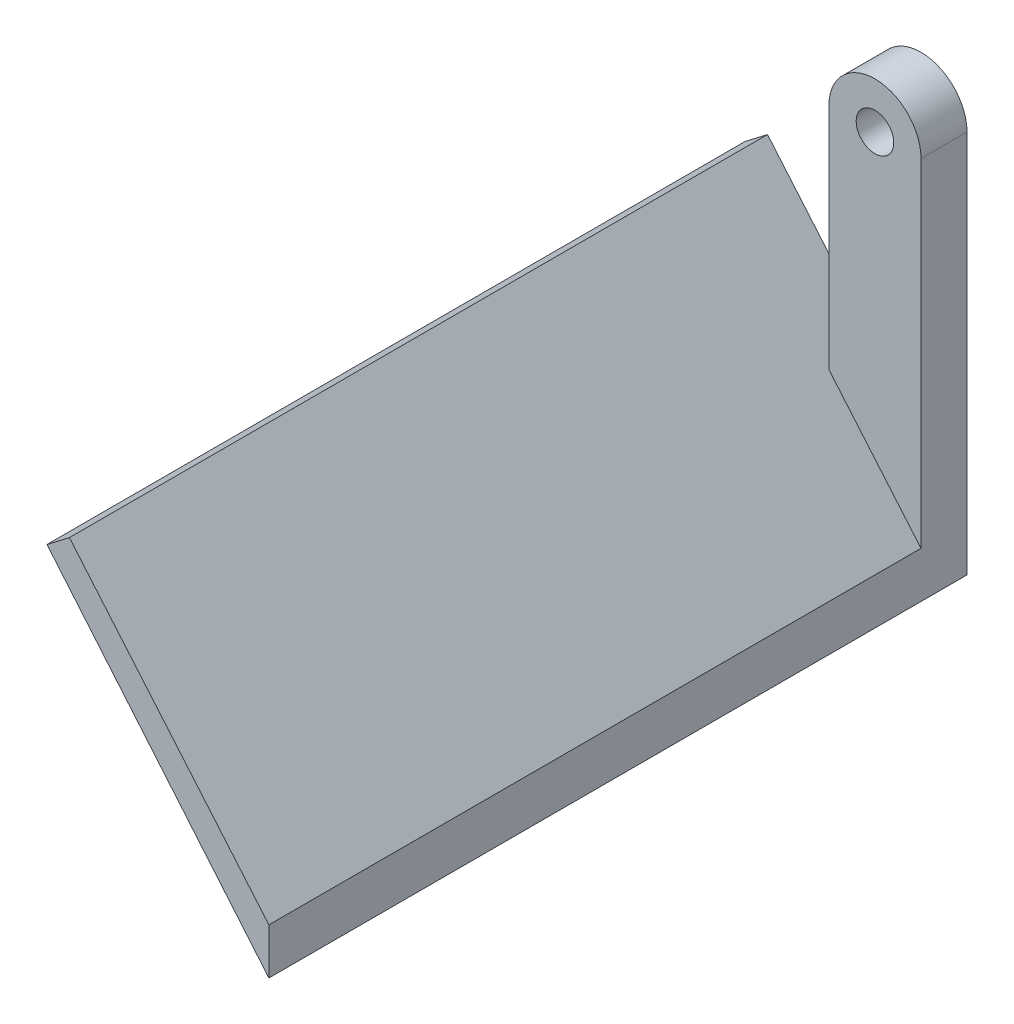
ISO-10303-21;
HEADER;
FILE_DESCRIPTION(('STEP AP214'),'2;1');
FILE_NAME('part.step','',(''),(''),'','','');
FILE_SCHEMA(('AUTOMOTIVE_DESIGN { 1 0 10303 214 1 1 1 1 }'));
ENDSEC;
DATA;
#1=APPLICATION_CONTEXT('core data for automotive mechanical design processes');
#2=APPLICATION_PROTOCOL_DEFINITION('international standard','automotive_design',2000,#1);
#3=PRODUCT_CONTEXT('',#1,'mechanical');
#4=PRODUCT('Part','Part','',(#3));
#5=PRODUCT_RELATED_PRODUCT_CATEGORY('part','',(#4));
#6=PRODUCT_DEFINITION_FORMATION('','',#4);
#7=PRODUCT_DEFINITION_CONTEXT('part definition',#1,'design');
#8=PRODUCT_DEFINITION('design','',#6,#7);
#9=PRODUCT_DEFINITION_SHAPE('','',#8);
#10=(LENGTH_UNIT() NAMED_UNIT(*) SI_UNIT(.MILLI.,.METRE.));
#11=(NAMED_UNIT(*) PLANE_ANGLE_UNIT() SI_UNIT($,.RADIAN.));
#12=(NAMED_UNIT(*) SI_UNIT($,.STERADIAN.) SOLID_ANGLE_UNIT());
#13=UNCERTAINTY_MEASURE_WITH_UNIT(LENGTH_MEASURE(1.E-05),#10,'distance_accuracy_value','');
#14=(GEOMETRIC_REPRESENTATION_CONTEXT(3) GLOBAL_UNCERTAINTY_ASSIGNED_CONTEXT((#13)) GLOBAL_UNIT_ASSIGNED_CONTEXT((#10,
#11,#12)) REPRESENTATION_CONTEXT('',''));
#15=CARTESIAN_POINT('',(0.,0.,0.));
#16=DIRECTION('',(0.,0.,1.));
#17=DIRECTION('',(1.,0.,0.));
#18=AXIS2_PLACEMENT_3D('',#15,#16,#17);
#19=CARTESIAN_POINT('',(5.10000000001886,-2.35037225318191E-11,-2903.88301881174));
#20=DIRECTION('',(0.,0.,-1.));
#21=DIRECTION('',(-1.,0.,0.));
#22=AXIS2_PLACEMENT_3D('',#19,#20,#21);
#23=PLANE('',#22);
#24=CARTESIAN_POINT('',(5.10000000001886,-2.35037225318191E-11,-2903.88301881174));
#25=DIRECTION('',(0.,0.,-1.));
#26=DIRECTION('',(-1.,0.,0.));
#27=AXIS2_PLACEMENT_3D('',#24,#25,#26);
#28=CIRCLE('',#27,2.45);
#29=CARTESIAN_POINT('',(2.65000000001886,-2.35037225318191E-11,-2903.88301881174));
#30=VERTEX_POINT('',#29);
#31=EDGE_CURVE('E166',#30,#30,#28,.T.);
#32=ORIENTED_EDGE('',*,*,#31,.T.);
#33=EDGE_LOOP('',(#32));
#34=FACE_BOUND('',#33,.T.);
#35=DIRECTION('',(-0.646174074926617,0.763190058172098,0.));
#36=VECTOR('',#35,1.);
#37=CARTESIAN_POINT('',(-13.1040053232568,-15.4128793657481,-2903.88301881174));
#38=LINE('',#37,#36);
#39=CARTESIAN_POINT('',(11.1000000000189,-44.0000000000235,-2903.88301881174));
#40=VERTEX_POINT('',#39);
#41=CARTESIAN_POINT('',(-0.899999999981139,-29.8269140570363,-2903.88301881174));
#42=VERTEX_POINT('',#41);
#43=EDGE_CURVE('E63',#40,#42,#38,.T.);
#44=ORIENTED_EDGE('',*,*,#43,.F.);
#45=DIRECTION('',(0.,-1.,0.));
#46=VECTOR('',#45,1.);
#47=CARTESIAN_POINT('',(11.1000000000189,-2.35037225318191E-11,-2903.88301881174));
#48=LINE('',#47,#46);
#49=CARTESIAN_POINT('',(11.1000000000189,-2.35037225318191E-11,-2903.88301881174));
#50=VERTEX_POINT('',#49);
#51=EDGE_CURVE('E187',#50,#40,#48,.T.);
#52=ORIENTED_EDGE('',*,*,#51,.F.);
#53=CARTESIAN_POINT('',(5.10000000001886,-2.35037225318191E-11,-2903.88301881174));
#54=DIRECTION('',(0.,0.,-1.));
#55=DIRECTION('',(-1.,0.,0.));
#56=AXIS2_PLACEMENT_3D('',#53,#54,#55);
#57=CIRCLE('',#56,6.);
#58=CARTESIAN_POINT('',(-0.899999999981139,-2.35037225318191E-11,-2903.88301881174));
#59=VERTEX_POINT('',#58);
#60=EDGE_CURVE('E170',#59,#50,#57,.T.);
#61=ORIENTED_EDGE('',*,*,#60,.F.);
#62=DIRECTION('',(0.,-1.,0.));
#63=VECTOR('',#62,1.);
#64=CARTESIAN_POINT('',(-0.899999999981139,-2.35037225318191E-11,-2903.88301881174));
#65=LINE('',#64,#63);
#66=EDGE_CURVE('E177',#59,#42,#65,.T.);
#67=ORIENTED_EDGE('',*,*,#66,.T.);
#68=EDGE_LOOP('',(#44,#52,#61,#67));
#69=FACE_BOUND('',#68,.T.);
#70=ADVANCED_FACE('F48',(#34,#69),#23,.F.);
#71=CARTESIAN_POINT('',(-0.899999999981139,-2.35037225318191E-11,-2909.88301881174));
#72=DIRECTION('',(-1.,0.,0.));
#73=DIRECTION('',(0.,-1.,0.));
#74=AXIS2_PLACEMENT_3D('',#71,#72,#73);
#75=PLANE('',#74);
#76=DIRECTION('',(0.,-1.,0.));
#77=VECTOR('',#76,1.);
#78=CARTESIAN_POINT('',(-0.899999999981139,-2.35037225318191E-11,-2909.88301881174));
#79=LINE('',#78,#77);
#80=CARTESIAN_POINT('',(-0.899999999981139,-2.35037225318191E-11,-2909.88301881174));
#81=VERTEX_POINT('',#80);
#82=CARTESIAN_POINT('',(-0.899999999981139,-29.8269140570363,-2909.88301881174));
#83=VERTEX_POINT('',#82);
#84=EDGE_CURVE('E70',#81,#83,#79,.T.);
#85=ORIENTED_EDGE('',*,*,#84,.T.);
#86=DIRECTION('',(0.,0.,1.));
#87=VECTOR('',#86,1.);
#88=CARTESIAN_POINT('',(-0.899999999981139,-29.8269140570363,-2909.88301881174));
#89=LINE('',#88,#87);
#90=EDGE_CURVE('E12',#83,#42,#89,.T.);
#91=ORIENTED_EDGE('',*,*,#90,.T.);
#92=ORIENTED_EDGE('',*,*,#66,.F.);
#93=DIRECTION('',(0.,0.,1.));
#94=VECTOR('',#93,1.);
#95=CARTESIAN_POINT('',(-0.899999999981139,-2.35037225318191E-11,-2909.88301881174));
#96=LINE('',#95,#94);
#97=EDGE_CURVE('E184',#81,#59,#96,.T.);
#98=ORIENTED_EDGE('',*,*,#97,.F.);
#99=EDGE_LOOP('',(#85,#91,#92,#98));
#100=FACE_BOUND('',#99,.T.);
#101=ADVANCED_FACE('F223',(#100),#75,.T.);
#102=CARTESIAN_POINT('',(5.10000000001886,-2.35037225318191E-11,-2909.88301881174));
#103=DIRECTION('',(0.,0.,-1.));
#104=DIRECTION('',(-1.,0.,0.));
#105=AXIS2_PLACEMENT_3D('',#102,#103,#104);
#106=PLANE('',#105);
#107=CARTESIAN_POINT('',(-0.899999999981141,-35.6989568888928,-2909.88301881174));
#108=VERTEX_POINT('',#107);
#109=CARTESIAN_POINT('',(-0.89999999998114,-50.0000000000235,-2909.88301881174));
#110=VERTEX_POINT('',#109);
#111=EDGE_CURVE('E182',#108,#110,#79,.T.);
#112=ORIENTED_EDGE('',*,*,#111,.F.);
#113=DIRECTION('',(-0.642787609686535,0.766044443118982,0.));
#114=VECTOR('',#113,1.);
#115=CARTESIAN_POINT('',(11.1000000000187,-50.0000000000234,-2909.88301881174));
#116=LINE('',#115,#114);
#117=CARTESIAN_POINT('',(-17.8254424358753,-15.5280000596692,-2909.88301881174));
#118=VERTEX_POINT('',#117);
#119=EDGE_CURVE('E155',#108,#118,#116,.T.);
#120=ORIENTED_EDGE('',*,*,#119,.T.);
#121=DIRECTION('',(0.793537757767937,0.608521016068168,0.));
#122=VECTOR('',#121,1.);
#123=CARTESIAN_POINT('',(-17.8254424358753,-15.5280000596692,-2909.88301881174));
#124=LINE('',#123,#122);
#125=CARTESIAN_POINT('',(-14.903598686534,-13.2873967490683,-2909.88301881174));
#126=VERTEX_POINT('',#125);
#127=EDGE_CURVE('E150',#118,#126,#124,.T.);
#128=ORIENTED_EDGE('',*,*,#127,.T.);
#129=DIRECTION('',(-0.646174074926617,0.763190058172098,0.));
#130=VECTOR('',#129,1.);
#131=CARTESIAN_POINT('',(11.1000000000187,-44.0000000000234,-2909.88301881174));
#132=LINE('',#131,#130);
#133=EDGE_CURVE('E148',#83,#126,#132,.T.);
#134=ORIENTED_EDGE('',*,*,#133,.F.);
#135=ORIENTED_EDGE('',*,*,#84,.F.);
#136=CARTESIAN_POINT('',(5.10000000001886,-2.35037225318191E-11,-2909.88301881174));
#137=DIRECTION('',(0.,0.,-1.));
#138=DIRECTION('',(-1.,0.,0.));
#139=AXIS2_PLACEMENT_3D('',#136,#137,#138);
#140=CIRCLE('',#139,6.);
#141=CARTESIAN_POINT('',(11.1000000000189,-2.35037225318191E-11,-2909.88301881174));
#142=VERTEX_POINT('',#141);
#143=EDGE_CURVE('E173',#81,#142,#140,.T.);
#144=ORIENTED_EDGE('',*,*,#143,.T.);
#145=DIRECTION('',(0.,-1.,0.));
#146=VECTOR('',#145,1.);
#147=CARTESIAN_POINT('',(11.1000000000189,-2.35037225318191E-11,-2909.88301881174));
#148=LINE('',#147,#146);
#149=CARTESIAN_POINT('',(11.1000000000189,-50.0000000000235,-2909.88301881174));
#150=VERTEX_POINT('',#149);
#151=EDGE_CURVE('E176',#142,#150,#148,.T.);
#152=ORIENTED_EDGE('',*,*,#151,.T.);
#153=DIRECTION('',(-1.,0.,0.));
#154=VECTOR('',#153,1.);
#155=CARTESIAN_POINT('',(11.1000000000189,-50.0000000000235,-2909.88301881174));
#156=LINE('',#155,#154);
#157=EDGE_CURVE('E179',#150,#110,#156,.T.);
#158=ORIENTED_EDGE('',*,*,#157,.T.);
#159=EDGE_LOOP('',(#112,#120,#128,#134,#135,#144,#152,#158));
#160=FACE_BOUND('',#159,.T.);
#161=CARTESIAN_POINT('',(5.10000000001886,-2.35037225318191E-11,-2909.88301881174));
#162=DIRECTION('',(0.,0.,-1.));
#163=DIRECTION('',(-1.,0.,0.));
#164=AXIS2_PLACEMENT_3D('',#161,#162,#163);
#165=CIRCLE('',#164,2.45);
#166=CARTESIAN_POINT('',(2.65000000001886,-2.35037225318191E-11,-2909.88301881174));
#167=VERTEX_POINT('',#166);
#168=EDGE_CURVE('E167',#167,#167,#165,.T.);
#169=ORIENTED_EDGE('',*,*,#168,.F.);
#170=EDGE_LOOP('',(#169));
#171=FACE_BOUND('',#170,.T.);
#172=ADVANCED_FACE('F217',(#160,#171),#106,.T.);
#173=DIRECTION('',(-1.,0.,0.));
#174=VECTOR('',#173,1.);
#175=CARTESIAN_POINT('',(11.1000000000189,-50.0000000000235,-2903.88301881174));
#176=LINE('',#175,#174);
#177=CARTESIAN_POINT('',(11.1000000000189,-50.0000000000235,-2903.88301881174));
#178=VERTEX_POINT('',#177);
#179=CARTESIAN_POINT('',(-0.89999999998114,-50.0000000000235,-2903.88301881174));
#180=VERTEX_POINT('',#179);
#181=EDGE_CURVE('E189',#178,#180,#176,.T.);
#182=ORIENTED_EDGE('',*,*,#181,.F.);
#183=DIRECTION('',(-0.642787609686535,0.766044443118982,0.));
#184=VECTOR('',#183,1.);
#185=CARTESIAN_POINT('',(-15.9992492922855,-17.7043722993133,-2903.88301881174));
#186=LINE('',#185,#184);
#187=CARTESIAN_POINT('',(-0.899999999981139,-35.6989568888928,-2903.88301881174));
#188=VERTEX_POINT('',#187);
#189=EDGE_CURVE('E129',#178,#188,#186,.T.);
#190=ORIENTED_EDGE('',*,*,#189,.T.);
#191=EDGE_CURVE('E192',#188,#180,#65,.T.);
#192=ORIENTED_EDGE('',*,*,#191,.T.);
#193=EDGE_LOOP('',(#182,#190,#192));
#194=FACE_BOUND('',#193,.T.);
#195=ADVANCED_FACE('F210',(#194),#23,.F.);
#196=CARTESIAN_POINT('',(5.10000000001886,-2.35037225318191E-11,-2909.88301881174));
#197=DIRECTION('',(0.,0.,1.));
#198=DIRECTION('',(1.,0.,0.));
#199=AXIS2_PLACEMENT_3D('',#196,#197,#198);
#200=CYLINDRICAL_SURFACE('',#199,6.);
#201=ORIENTED_EDGE('',*,*,#60,.T.);
#202=DIRECTION('',(0.,0.,1.));
#203=VECTOR('',#202,1.);
#204=CARTESIAN_POINT('',(11.1000000000189,-2.35037225318191E-11,-2909.88301881174));
#205=LINE('',#204,#203);
#206=EDGE_CURVE('E200',#142,#50,#205,.T.);
#207=ORIENTED_EDGE('',*,*,#206,.F.);
#208=ORIENTED_EDGE('',*,*,#143,.F.);
#209=ORIENTED_EDGE('',*,*,#97,.T.);
#210=EDGE_LOOP('',(#201,#207,#208,#209));
#211=FACE_BOUND('',#210,.T.);
#212=ADVANCED_FACE('F50',(#211),#200,.T.);
#213=CARTESIAN_POINT('',(11.1000000000189,-2.35037225318191E-11,-2909.88301881174));
#214=DIRECTION('',(-1.,0.,0.));
#215=DIRECTION('',(0.,0.,1.));
#216=AXIS2_PLACEMENT_3D('',#213,#214,#215);
#217=PLANE('',#216);
#218=DIRECTION('',(0.,0.,1.));
#219=VECTOR('',#218,1.);
#220=CARTESIAN_POINT('',(11.1000000000189,-50.0000000000235,-2909.88301881174));
#221=LINE('',#220,#219);
#222=EDGE_CURVE('E198',#150,#178,#221,.T.);
#223=ORIENTED_EDGE('',*,*,#222,.F.);
#224=ORIENTED_EDGE('',*,*,#151,.F.);
#225=ORIENTED_EDGE('',*,*,#206,.T.);
#226=ORIENTED_EDGE('',*,*,#51,.T.);
#227=DIRECTION('',(0.,0.,-1.));
#228=VECTOR('',#227,1.);
#229=CARTESIAN_POINT('',(11.1000000000187,-44.0000000000234,-2818.88301881174));
#230=LINE('',#229,#228);
#231=CARTESIAN_POINT('',(11.1000000000187,-44.0000000000234,-2818.88301881174));
#232=VERTEX_POINT('',#231);
#233=EDGE_CURVE('E146',#232,#40,#230,.T.);
#234=ORIENTED_EDGE('',*,*,#233,.F.);
#235=DIRECTION('',(0.,-1.,0.));
#236=VECTOR('',#235,1.);
#237=CARTESIAN_POINT('',(11.1000000000187,-44.0000000000234,-2818.88301881174));
#238=LINE('',#237,#236);
#239=CARTESIAN_POINT('',(11.1000000000187,-50.0000000000234,-2818.88301881174));
#240=VERTEX_POINT('',#239);
#241=EDGE_CURVE('E140',#232,#240,#238,.T.);
#242=ORIENTED_EDGE('',*,*,#241,.T.);
#243=DIRECTION('',(0.,0.,-1.));
#244=VECTOR('',#243,1.);
#245=CARTESIAN_POINT('',(11.1000000000187,-50.0000000000234,-2818.88301881174));
#246=LINE('',#245,#244);
#247=EDGE_CURVE('E123',#240,#178,#246,.T.);
#248=ORIENTED_EDGE('',*,*,#247,.T.);
#249=EDGE_LOOP('',(#223,#224,#225,#226,#234,#242,#248));
#250=FACE_BOUND('',#249,.T.);
#251=ADVANCED_FACE('F144',(#250),#217,.F.);
#252=CARTESIAN_POINT('',(11.1000000000189,-50.0000000000235,-2909.88301881174));
#253=DIRECTION('',(0.,1.,0.));
#254=DIRECTION('',(0.,0.,1.));
#255=AXIS2_PLACEMENT_3D('',#252,#253,#254);
#256=PLANE('',#255);
#257=ORIENTED_EDGE('',*,*,#181,.T.);
#258=DIRECTION('',(0.,0.,1.));
#259=VECTOR('',#258,1.);
#260=CARTESIAN_POINT('',(-0.89999999998114,-50.0000000000235,-2909.88301881174));
#261=LINE('',#260,#259);
#262=EDGE_CURVE('E195',#110,#180,#261,.T.);
#263=ORIENTED_EDGE('',*,*,#262,.F.);
#264=ORIENTED_EDGE('',*,*,#157,.F.);
#265=ORIENTED_EDGE('',*,*,#222,.T.);
#266=EDGE_LOOP('',(#257,#263,#264,#265));
#267=FACE_BOUND('',#266,.T.);
#268=ADVANCED_FACE('F212',(#267),#256,.F.);
#269=DIRECTION('',(0.,0.,1.));
#270=VECTOR('',#269,1.);
#271=CARTESIAN_POINT('',(-0.899999999981139,-35.6989568888928,-2909.88301881174));
#272=LINE('',#271,#270);
#273=EDGE_CURVE('E56',#108,#188,#272,.T.);
#274=ORIENTED_EDGE('',*,*,#273,.F.);
#275=ORIENTED_EDGE('',*,*,#111,.T.);
#276=ORIENTED_EDGE('',*,*,#262,.T.);
#277=ORIENTED_EDGE('',*,*,#191,.F.);
#278=EDGE_LOOP('',(#274,#275,#276,#277));
#279=FACE_BOUND('',#278,.T.);
#280=ADVANCED_FACE('F206',(#279),#75,.T.);
#281=CARTESIAN_POINT('',(5.10000000001886,-2.35037225318191E-11,-2909.88301881174));
#282=DIRECTION('',(0.,0.,1.));
#283=DIRECTION('',(1.,0.,0.));
#284=AXIS2_PLACEMENT_3D('',#281,#282,#283);
#285=CYLINDRICAL_SURFACE('',#284,2.45);
#286=ORIENTED_EDGE('',*,*,#168,.T.);
#287=EDGE_LOOP('',(#286));
#288=FACE_BOUND('',#287,.T.);
#289=ORIENTED_EDGE('',*,*,#31,.F.);
#290=EDGE_LOOP('',(#289));
#291=FACE_BOUND('',#290,.T.);
#292=ADVANCED_FACE('F255',(#288,#291),#285,.F.);
#293=CARTESIAN_POINT('',(11.1000000000187,-44.0000000000234,-2818.88301881174));
#294=DIRECTION('',(-0.763190058172098,-0.646174074926617,0.));
#295=DIRECTION('',(0.646174074926617,-0.763190058172098,0.));
#296=AXIS2_PLACEMENT_3D('',#293,#294,#295);
#297=PLANE('',#296);
#298=ORIENTED_EDGE('',*,*,#233,.T.);
#299=ORIENTED_EDGE('',*,*,#43,.T.);
#300=ORIENTED_EDGE('',*,*,#90,.F.);
#301=ORIENTED_EDGE('',*,*,#133,.T.);
#302=DIRECTION('',(0.,0.,-1.));
#303=VECTOR('',#302,1.);
#304=CARTESIAN_POINT('',(-14.903598686534,-13.2873967490683,-2818.88301881174));
#305=LINE('',#304,#303);
#306=CARTESIAN_POINT('',(-14.903598686534,-13.2873967490683,-2818.88301881174));
#307=VERTEX_POINT('',#306);
#308=EDGE_CURVE('E160',#307,#126,#305,.T.);
#309=ORIENTED_EDGE('',*,*,#308,.F.);
#310=DIRECTION('',(-0.646174074926617,0.763190058172098,0.));
#311=VECTOR('',#310,1.);
#312=CARTESIAN_POINT('',(11.1000000000187,-44.0000000000234,-2818.88301881174));
#313=LINE('',#312,#311);
#314=EDGE_CURVE('E134',#232,#307,#313,.T.);
#315=ORIENTED_EDGE('',*,*,#314,.F.);
#316=EDGE_LOOP('',(#298,#299,#300,#301,#309,#315));
#317=FACE_BOUND('',#316,.T.);
#318=ADVANCED_FACE('F225',(#317),#297,.F.);
#319=CARTESIAN_POINT('',(11.1000000000187,-50.0000000000234,-2818.88301881174));
#320=DIRECTION('',(-0.766044443118982,-0.642787609686535,0.));
#321=DIRECTION('',(0.642787609686535,-0.766044443118982,0.));
#322=AXIS2_PLACEMENT_3D('',#319,#320,#321);
#323=PLANE('',#322);
#324=ORIENTED_EDGE('',*,*,#189,.F.);
#325=ORIENTED_EDGE('',*,*,#247,.F.);
#326=DIRECTION('',(-0.642787609686535,0.766044443118982,0.));
#327=VECTOR('',#326,1.);
#328=CARTESIAN_POINT('',(11.1000000000187,-50.0000000000234,-2818.88301881174));
#329=LINE('',#328,#327);
#330=CARTESIAN_POINT('',(-17.8254424358753,-15.5280000596692,-2818.88301881174));
#331=VERTEX_POINT('',#330);
#332=EDGE_CURVE('E127',#240,#331,#329,.T.);
#333=ORIENTED_EDGE('',*,*,#332,.T.);
#334=DIRECTION('',(0.,0.,-1.));
#335=VECTOR('',#334,1.);
#336=CARTESIAN_POINT('',(-17.8254424358753,-15.5280000596692,-2818.88301881174));
#337=LINE('',#336,#335);
#338=EDGE_CURVE('E133',#331,#118,#337,.T.);
#339=ORIENTED_EDGE('',*,*,#338,.T.);
#340=ORIENTED_EDGE('',*,*,#119,.F.);
#341=ORIENTED_EDGE('',*,*,#273,.T.);
#342=EDGE_LOOP('',(#324,#325,#333,#339,#340,#341));
#343=FACE_BOUND('',#342,.T.);
#344=ADVANCED_FACE('F125',(#343),#323,.T.);
#345=CARTESIAN_POINT('',(-17.8254424358753,-15.5280000596692,-2818.88301881174));
#346=DIRECTION('',(-0.608521016068168,0.793537757767937,0.));
#347=DIRECTION('',(-0.793537757767937,-0.608521016068168,0.));
#348=AXIS2_PLACEMENT_3D('',#345,#346,#347);
#349=PLANE('',#348);
#350=ORIENTED_EDGE('',*,*,#127,.F.);
#351=ORIENTED_EDGE('',*,*,#338,.F.);
#352=DIRECTION('',(0.793537757767937,0.608521016068168,0.));
#353=VECTOR('',#352,1.);
#354=CARTESIAN_POINT('',(-17.8254424358753,-15.5280000596692,-2818.88301881174));
#355=LINE('',#354,#353);
#356=EDGE_CURVE('E142',#331,#307,#355,.T.);
#357=ORIENTED_EDGE('',*,*,#356,.T.);
#358=ORIENTED_EDGE('',*,*,#308,.T.);
#359=EDGE_LOOP('',(#350,#351,#357,#358));
#360=FACE_BOUND('',#359,.T.);
#361=ADVANCED_FACE('F229',(#360),#349,.T.);
#362=CARTESIAN_POINT('',(0.,0.,-2818.88301881174));
#363=DIRECTION('',(0.,0.,1.));
#364=DIRECTION('',(1.,0.,0.));
#365=AXIS2_PLACEMENT_3D('',#362,#363,#364);
#366=PLANE('',#365);
#367=ORIENTED_EDGE('',*,*,#241,.F.);
#368=ORIENTED_EDGE('',*,*,#314,.T.);
#369=ORIENTED_EDGE('',*,*,#356,.F.);
#370=ORIENTED_EDGE('',*,*,#332,.F.);
#371=EDGE_LOOP('',(#367,#368,#369,#370));
#372=FACE_BOUND('',#371,.T.);
#373=ADVANCED_FACE('F139',(#372),#366,.T.);
#374=CLOSED_SHELL('',(#70,#101,#172,#195,#212,#251,#268,#280,#292,#318,#344,#361,#373));
#375=MANIFOLD_SOLID_BREP('B2',#374);
#376=ADVANCED_BREP_SHAPE_REPRESENTATION('',(#18,#375),#14);
#377=SHAPE_DEFINITION_REPRESENTATION(#9,#376);
ENDSEC;
END-ISO-10303-21;
